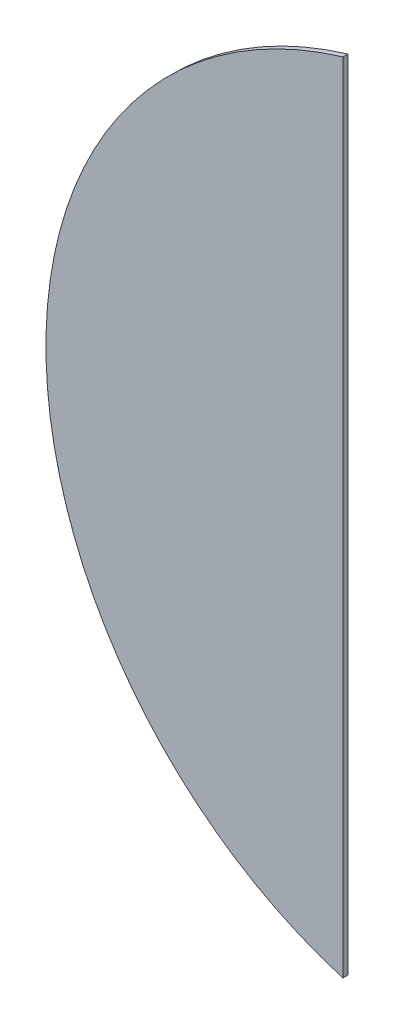
ISO-10303-21;
HEADER;
FILE_DESCRIPTION(('STEP AP214'),'2;1');
FILE_NAME('part.step','',(''),(''),'','','');
FILE_SCHEMA(('AUTOMOTIVE_DESIGN { 1 0 10303 214 1 1 1 1 }'));
ENDSEC;
DATA;
#1=APPLICATION_CONTEXT('core data for automotive mechanical design processes');
#2=APPLICATION_PROTOCOL_DEFINITION('international standard','automotive_design',2000,#1);
#3=PRODUCT_CONTEXT('',#1,'mechanical');
#4=PRODUCT('Part','Part','',(#3));
#5=PRODUCT_RELATED_PRODUCT_CATEGORY('part','',(#4));
#6=PRODUCT_DEFINITION_FORMATION('','',#4);
#7=PRODUCT_DEFINITION_CONTEXT('part definition',#1,'design');
#8=PRODUCT_DEFINITION('design','',#6,#7);
#9=PRODUCT_DEFINITION_SHAPE('','',#8);
#10=(LENGTH_UNIT() NAMED_UNIT(*) SI_UNIT(.MILLI.,.METRE.));
#11=(NAMED_UNIT(*) PLANE_ANGLE_UNIT() SI_UNIT($,.RADIAN.));
#12=(NAMED_UNIT(*) SI_UNIT($,.STERADIAN.) SOLID_ANGLE_UNIT());
#13=UNCERTAINTY_MEASURE_WITH_UNIT(LENGTH_MEASURE(1.E-05),#10,'distance_accuracy_value','');
#14=(GEOMETRIC_REPRESENTATION_CONTEXT(3) GLOBAL_UNCERTAINTY_ASSIGNED_CONTEXT((#13)) GLOBAL_UNIT_ASSIGNED_CONTEXT((#10,
#11,#12)) REPRESENTATION_CONTEXT('',''));
#15=CARTESIAN_POINT('',(0.,0.,0.));
#16=DIRECTION('',(0.,0.,1.));
#17=DIRECTION('',(1.,0.,0.));
#18=AXIS2_PLACEMENT_3D('',#15,#16,#17);
#19=CARTESIAN_POINT('',(487.274543217517,0.,2.));
#20=DIRECTION('',(0.,0.,-1.));
#21=DIRECTION('',(-1.,0.,0.));
#22=AXIS2_PLACEMENT_3D('',#19,#20,#21);
#23=CYLINDRICAL_SURFACE('',#22,166.759457594888);
#24=CARTESIAN_POINT('',(487.274543217517,0.,0.));
#25=DIRECTION('',(0.,0.,1.));
#26=DIRECTION('',(1.,0.,0.));
#27=AXIS2_PLACEMENT_3D('',#24,#25,#26);
#28=CIRCLE('',#27,166.759457594888);
#29=CARTESIAN_POINT('',(439.464376559185,159.758895406309,0.));
#30=VERTEX_POINT('',#29);
#31=CARTESIAN_POINT('',(439.464376559185,-159.758895406309,0.));
#32=VERTEX_POINT('',#31);
#33=EDGE_CURVE('E68',#30,#32,#28,.T.);
#34=ORIENTED_EDGE('',*,*,#33,.T.);
#35=DIRECTION('',(0.,0.,-1.));
#36=VECTOR('',#35,1.);
#37=CARTESIAN_POINT('',(439.464376559185,-159.758895406309,2.));
#38=LINE('',#37,#36);
#39=CARTESIAN_POINT('',(439.464376559185,-159.758895406309,2.));
#40=VERTEX_POINT('',#39);
#41=EDGE_CURVE('E11',#40,#32,#38,.T.);
#42=ORIENTED_EDGE('',*,*,#41,.F.);
#43=CARTESIAN_POINT('',(487.274543217517,0.,2.));
#44=DIRECTION('',(0.,0.,1.));
#45=DIRECTION('',(1.,0.,0.));
#46=AXIS2_PLACEMENT_3D('',#43,#44,#45);
#47=CIRCLE('',#46,166.759457594888);
#48=CARTESIAN_POINT('',(439.464376559185,159.758895406309,2.));
#49=VERTEX_POINT('',#48);
#50=EDGE_CURVE('E67',#49,#40,#47,.T.);
#51=ORIENTED_EDGE('',*,*,#50,.F.);
#52=DIRECTION('',(0.,0.,-1.));
#53=VECTOR('',#52,1.);
#54=CARTESIAN_POINT('',(439.464376559185,159.758895406309,2.));
#55=LINE('',#54,#53);
#56=EDGE_CURVE('E45',#49,#30,#55,.T.);
#57=ORIENTED_EDGE('',*,*,#56,.T.);
#58=EDGE_LOOP('',(#34,#42,#51,#57));
#59=FACE_BOUND('',#58,.T.);
#60=ADVANCED_FACE('F37',(#59),#23,.T.);
#61=CARTESIAN_POINT('',(439.464376559185,159.758895406309,2.));
#62=DIRECTION('',(-1.,0.,0.));
#63=DIRECTION('',(0.,0.,1.));
#64=AXIS2_PLACEMENT_3D('',#61,#62,#63);
#65=PLANE('',#64);
#66=DIRECTION('',(0.,1.,0.));
#67=VECTOR('',#66,1.);
#68=CARTESIAN_POINT('',(439.464376559185,159.758895406309,0.));
#69=LINE('',#68,#67);
#70=EDGE_CURVE('E60',#32,#30,#69,.T.);
#71=ORIENTED_EDGE('',*,*,#70,.T.);
#72=ORIENTED_EDGE('',*,*,#56,.F.);
#73=DIRECTION('',(0.,1.,0.));
#74=VECTOR('',#73,1.);
#75=CARTESIAN_POINT('',(439.464376559185,159.758895406309,2.));
#76=LINE('',#75,#74);
#77=EDGE_CURVE('E52',#40,#49,#76,.T.);
#78=ORIENTED_EDGE('',*,*,#77,.F.);
#79=ORIENTED_EDGE('',*,*,#41,.T.);
#80=EDGE_LOOP('',(#71,#72,#78,#79));
#81=FACE_BOUND('',#80,.T.);
#82=ADVANCED_FACE('F63',(#81),#65,.F.);
#83=CARTESIAN_POINT('',(487.274543217517,0.,2.));
#84=DIRECTION('',(0.,0.,1.));
#85=DIRECTION('',(1.,0.,0.));
#86=AXIS2_PLACEMENT_3D('',#83,#84,#85);
#87=PLANE('',#86);
#88=ORIENTED_EDGE('',*,*,#50,.T.);
#89=ORIENTED_EDGE('',*,*,#77,.T.);
#90=EDGE_LOOP('',(#88,#89));
#91=FACE_BOUND('',#90,.T.);
#92=ADVANCED_FACE('F75',(#91),#87,.T.);
#93=CARTESIAN_POINT('',(487.274543217517,0.,0.));
#94=DIRECTION('',(0.,0.,1.));
#95=DIRECTION('',(1.,0.,0.));
#96=AXIS2_PLACEMENT_3D('',#93,#94,#95);
#97=PLANE('',#96);
#98=ORIENTED_EDGE('',*,*,#33,.F.);
#99=ORIENTED_EDGE('',*,*,#70,.F.);
#100=EDGE_LOOP('',(#98,#99));
#101=FACE_BOUND('',#100,.T.);
#102=ADVANCED_FACE('F71',(#101),#97,.F.);
#103=CLOSED_SHELL('',(#60,#82,#92,#102));
#104=MANIFOLD_SOLID_BREP('B2',#103);
#105=ADVANCED_BREP_SHAPE_REPRESENTATION('',(#18,#104),#14);
#106=SHAPE_DEFINITION_REPRESENTATION(#9,#105);
ENDSEC;
END-ISO-10303-21;
